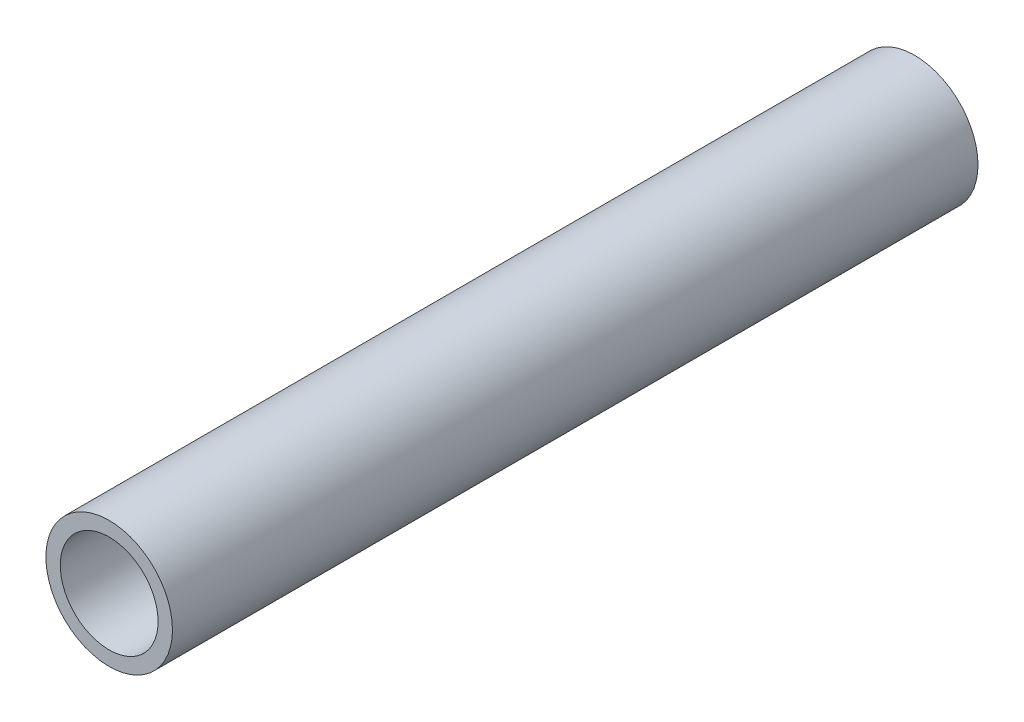
ISO-10303-21;
HEADER;
FILE_DESCRIPTION(('STEP AP214'),'2;1');
FILE_NAME('part.step','',(''),(''),'','','');
FILE_SCHEMA(('AUTOMOTIVE_DESIGN { 1 0 10303 214 1 1 1 1 }'));
ENDSEC;
DATA;
#1=APPLICATION_CONTEXT('core data for automotive mechanical design processes');
#2=APPLICATION_PROTOCOL_DEFINITION('international standard','automotive_design',2000,#1);
#3=PRODUCT_CONTEXT('',#1,'mechanical');
#4=PRODUCT('Part','Part','',(#3));
#5=PRODUCT_RELATED_PRODUCT_CATEGORY('part','',(#4));
#6=PRODUCT_DEFINITION_FORMATION('','',#4);
#7=PRODUCT_DEFINITION_CONTEXT('part definition',#1,'design');
#8=PRODUCT_DEFINITION('design','',#6,#7);
#9=PRODUCT_DEFINITION_SHAPE('','',#8);
#10=(LENGTH_UNIT() NAMED_UNIT(*) SI_UNIT(.MILLI.,.METRE.));
#11=(NAMED_UNIT(*) PLANE_ANGLE_UNIT() SI_UNIT($,.RADIAN.));
#12=(NAMED_UNIT(*) SI_UNIT($,.STERADIAN.) SOLID_ANGLE_UNIT());
#13=UNCERTAINTY_MEASURE_WITH_UNIT(LENGTH_MEASURE(1.E-05),#10,'distance_accuracy_value','');
#14=(GEOMETRIC_REPRESENTATION_CONTEXT(3) GLOBAL_UNCERTAINTY_ASSIGNED_CONTEXT((#13)) GLOBAL_UNIT_ASSIGNED_CONTEXT((#10,
#11,#12)) REPRESENTATION_CONTEXT('',''));
#15=CARTESIAN_POINT('',(0.,0.,0.));
#16=DIRECTION('',(0.,0.,1.));
#17=DIRECTION('',(1.,0.,0.));
#18=AXIS2_PLACEMENT_3D('',#15,#16,#17);
#19=CARTESIAN_POINT('',(0.,0.,140.));
#20=DIRECTION('',(0.,0.,1.));
#21=DIRECTION('',(1.,0.,0.));
#22=AXIS2_PLACEMENT_3D('',#19,#20,#21);
#23=PLANE('',#22);
#24=CARTESIAN_POINT('',(0.,0.,140.));
#25=DIRECTION('',(0.,0.,1.));
#26=DIRECTION('',(1.,0.,0.));
#27=AXIS2_PLACEMENT_3D('',#24,#25,#26);
#28=CIRCLE('',#27,11.);
#29=CARTESIAN_POINT('',(11.,0.,140.));
#30=VERTEX_POINT('',#29);
#31=EDGE_CURVE('E10',#30,#30,#28,.T.);
#32=ORIENTED_EDGE('',*,*,#31,.T.);
#33=EDGE_LOOP('',(#32));
#34=FACE_BOUND('',#33,.T.);
#35=CARTESIAN_POINT('',(0.,0.,140.));
#36=DIRECTION('',(0.,0.,1.));
#37=DIRECTION('',(1.,0.,0.));
#38=AXIS2_PLACEMENT_3D('',#35,#36,#37);
#39=CIRCLE('',#38,8.5);
#40=CARTESIAN_POINT('',(8.5,0.,140.));
#41=VERTEX_POINT('',#40);
#42=EDGE_CURVE('E42',#41,#41,#39,.T.);
#43=ORIENTED_EDGE('',*,*,#42,.F.);
#44=EDGE_LOOP('',(#43));
#45=FACE_BOUND('',#44,.T.);
#46=ADVANCED_FACE('F31',(#34,#45),#23,.T.);
#47=CARTESIAN_POINT('',(0.,0.,0.));
#48=DIRECTION('',(0.,0.,1.));
#49=DIRECTION('',(1.,0.,0.));
#50=AXIS2_PLACEMENT_3D('',#47,#48,#49);
#51=PLANE('',#50);
#52=CARTESIAN_POINT('',(0.,0.,0.));
#53=DIRECTION('',(0.,0.,1.));
#54=DIRECTION('',(1.,0.,0.));
#55=AXIS2_PLACEMENT_3D('',#52,#53,#54);
#56=CIRCLE('',#55,11.);
#57=CARTESIAN_POINT('',(11.,0.,0.));
#58=VERTEX_POINT('',#57);
#59=EDGE_CURVE('E35',#58,#58,#56,.T.);
#60=ORIENTED_EDGE('',*,*,#59,.F.);
#61=EDGE_LOOP('',(#60));
#62=FACE_BOUND('',#61,.T.);
#63=CARTESIAN_POINT('',(0.,0.,0.));
#64=DIRECTION('',(0.,0.,1.));
#65=DIRECTION('',(1.,0.,0.));
#66=AXIS2_PLACEMENT_3D('',#63,#64,#65);
#67=CIRCLE('',#66,8.5);
#68=CARTESIAN_POINT('',(8.5,0.,0.));
#69=VERTEX_POINT('',#68);
#70=EDGE_CURVE('E44',#69,#69,#67,.T.);
#71=ORIENTED_EDGE('',*,*,#70,.T.);
#72=EDGE_LOOP('',(#71));
#73=FACE_BOUND('',#72,.T.);
#74=ADVANCED_FACE('F54',(#62,#73),#51,.F.);
#75=CARTESIAN_POINT('',(0.,0.,140.));
#76=DIRECTION('',(0.,0.,-1.));
#77=DIRECTION('',(-1.,0.,0.));
#78=AXIS2_PLACEMENT_3D('',#75,#76,#77);
#79=CYLINDRICAL_SURFACE('',#78,11.);
#80=ORIENTED_EDGE('',*,*,#31,.F.);
#81=EDGE_LOOP('',(#80));
#82=FACE_BOUND('',#81,.T.);
#83=ORIENTED_EDGE('',*,*,#59,.T.);
#84=EDGE_LOOP('',(#83));
#85=FACE_BOUND('',#84,.T.);
#86=ADVANCED_FACE('F33',(#82,#85),#79,.T.);
#87=CARTESIAN_POINT('',(0.,0.,140.));
#88=DIRECTION('',(0.,0.,-1.));
#89=DIRECTION('',(-1.,0.,0.));
#90=AXIS2_PLACEMENT_3D('',#87,#88,#89);
#91=CYLINDRICAL_SURFACE('',#90,8.5);
#92=ORIENTED_EDGE('',*,*,#42,.T.);
#93=EDGE_LOOP('',(#92));
#94=FACE_BOUND('',#93,.T.);
#95=ORIENTED_EDGE('',*,*,#70,.F.);
#96=EDGE_LOOP('',(#95));
#97=FACE_BOUND('',#96,.T.);
#98=ADVANCED_FACE('F50',(#94,#97),#91,.F.);
#99=CLOSED_SHELL('',(#46,#74,#86,#98));
#100=MANIFOLD_SOLID_BREP('B2',#99);
#101=ADVANCED_BREP_SHAPE_REPRESENTATION('',(#18,#100),#14);
#102=SHAPE_DEFINITION_REPRESENTATION(#9,#101);
ENDSEC;
END-ISO-10303-21;
